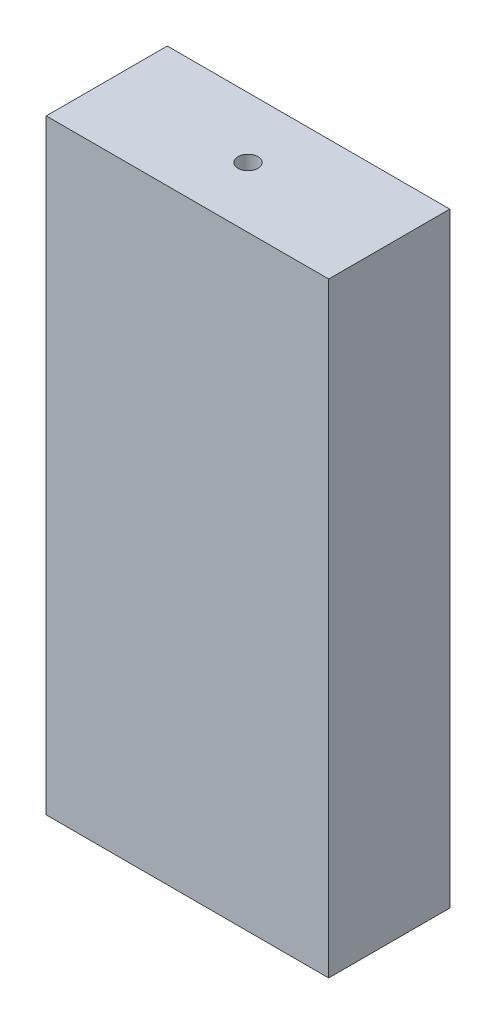
ISO-10303-21;
HEADER;
FILE_DESCRIPTION(('STEP AP214'),'2;1');
FILE_NAME('part.step','',(''),(''),'','','');
FILE_SCHEMA(('AUTOMOTIVE_DESIGN { 1 0 10303 214 1 1 1 1 }'));
ENDSEC;
DATA;
#1=APPLICATION_CONTEXT('core data for automotive mechanical design processes');
#2=APPLICATION_PROTOCOL_DEFINITION('international standard','automotive_design',2000,#1);
#3=PRODUCT_CONTEXT('',#1,'mechanical');
#4=PRODUCT('Part','Part','',(#3));
#5=PRODUCT_RELATED_PRODUCT_CATEGORY('part','',(#4));
#6=PRODUCT_DEFINITION_FORMATION('','',#4);
#7=PRODUCT_DEFINITION_CONTEXT('part definition',#1,'design');
#8=PRODUCT_DEFINITION('design','',#6,#7);
#9=PRODUCT_DEFINITION_SHAPE('','',#8);
#10=(LENGTH_UNIT() NAMED_UNIT(*) SI_UNIT(.MILLI.,.METRE.));
#11=(NAMED_UNIT(*) PLANE_ANGLE_UNIT() SI_UNIT($,.RADIAN.));
#12=(NAMED_UNIT(*) SI_UNIT($,.STERADIAN.) SOLID_ANGLE_UNIT());
#13=UNCERTAINTY_MEASURE_WITH_UNIT(LENGTH_MEASURE(1.E-05),#10,'distance_accuracy_value','');
#14=(GEOMETRIC_REPRESENTATION_CONTEXT(3) GLOBAL_UNCERTAINTY_ASSIGNED_CONTEXT((#13)) GLOBAL_UNIT_ASSIGNED_CONTEXT((#10,
#11,#12)) REPRESENTATION_CONTEXT('',''));
#15=CARTESIAN_POINT('',(0.,0.,0.));
#16=DIRECTION('',(0.,0.,1.));
#17=DIRECTION('',(1.,0.,0.));
#18=AXIS2_PLACEMENT_3D('',#15,#16,#17);
#19=CARTESIAN_POINT('',(0.,190.5,0.));
#20=DIRECTION('',(0.,-1.,0.));
#21=DIRECTION('',(0.,0.,-1.));
#22=AXIS2_PLACEMENT_3D('',#19,#20,#21);
#23=PLANE('',#22);
#24=DIRECTION('',(0.,0.,1.));
#25=VECTOR('',#24,1.);
#26=CARTESIAN_POINT('',(0.,190.5,0.));
#27=LINE('',#26,#25);
#28=CARTESIAN_POINT('',(0.,190.5,-38.1));
#29=VERTEX_POINT('',#28);
#30=CARTESIAN_POINT('',(0.,190.5,0.));
#31=VERTEX_POINT('',#30);
#32=EDGE_CURVE('E92',#29,#31,#27,.T.);
#33=ORIENTED_EDGE('',*,*,#32,.T.);
#34=DIRECTION('',(1.,0.,0.));
#35=VECTOR('',#34,1.);
#36=CARTESIAN_POINT('',(0.,190.5,0.));
#37=LINE('',#36,#35);
#38=CARTESIAN_POINT('',(88.9,190.5,0.));
#39=VERTEX_POINT('',#38);
#40=EDGE_CURVE('E87',#31,#39,#37,.T.);
#41=ORIENTED_EDGE('',*,*,#40,.T.);
#42=DIRECTION('',(0.,0.,-1.));
#43=VECTOR('',#42,1.);
#44=CARTESIAN_POINT('',(88.9,190.5,0.));
#45=LINE('',#44,#43);
#46=CARTESIAN_POINT('',(88.9,190.5,-38.1));
#47=VERTEX_POINT('',#46);
#48=EDGE_CURVE('E90',#39,#47,#45,.T.);
#49=ORIENTED_EDGE('',*,*,#48,.T.);
#50=DIRECTION('',(-1.,0.,0.));
#51=VECTOR('',#50,1.);
#52=CARTESIAN_POINT('',(0.,190.5,-38.1));
#53=LINE('',#52,#51);
#54=EDGE_CURVE('E57',#47,#29,#53,.T.);
#55=ORIENTED_EDGE('',*,*,#54,.T.);
#56=EDGE_LOOP('',(#33,#41,#49,#55));
#57=FACE_BOUND('',#56,.T.);
#58=CARTESIAN_POINT('',(44.45,190.5,-19.05));
#59=DIRECTION('',(0.,1.,0.));
#60=DIRECTION('',(0.,0.,1.));
#61=AXIS2_PLACEMENT_3D('',#58,#59,#60);
#62=CIRCLE('',#61,3.175);
#63=CARTESIAN_POINT('',(44.45,190.5,-15.875));
#64=VERTEX_POINT('',#63);
#65=EDGE_CURVE('E112',#64,#64,#62,.T.);
#66=ORIENTED_EDGE('',*,*,#65,.F.);
#67=EDGE_LOOP('',(#66));
#68=FACE_BOUND('',#67,.T.);
#69=ADVANCED_FACE('F39',(#57,#68),#23,.F.);
#70=CARTESIAN_POINT('',(0.,0.,0.));
#71=DIRECTION('',(0.,-1.,0.));
#72=DIRECTION('',(0.,0.,-1.));
#73=AXIS2_PLACEMENT_3D('',#70,#71,#72);
#74=PLANE('',#73);
#75=DIRECTION('',(0.,0.,1.));
#76=VECTOR('',#75,1.);
#77=CARTESIAN_POINT('',(0.,0.,0.));
#78=LINE('',#77,#76);
#79=CARTESIAN_POINT('',(0.,0.,-38.1));
#80=VERTEX_POINT('',#79);
#81=CARTESIAN_POINT('',(0.,0.,0.));
#82=VERTEX_POINT('',#81);
#83=EDGE_CURVE('E108',#80,#82,#78,.T.);
#84=ORIENTED_EDGE('',*,*,#83,.F.);
#85=DIRECTION('',(-1.,0.,0.));
#86=VECTOR('',#85,1.);
#87=CARTESIAN_POINT('',(0.,0.,-38.1));
#88=LINE('',#87,#86);
#89=CARTESIAN_POINT('',(88.9,0.,-38.1));
#90=VERTEX_POINT('',#89);
#91=EDGE_CURVE('E80',#90,#80,#88,.T.);
#92=ORIENTED_EDGE('',*,*,#91,.F.);
#93=DIRECTION('',(0.,0.,-1.));
#94=VECTOR('',#93,1.);
#95=CARTESIAN_POINT('',(88.9,0.,0.));
#96=LINE('',#95,#94);
#97=CARTESIAN_POINT('',(88.9,0.,0.));
#98=VERTEX_POINT('',#97);
#99=EDGE_CURVE('E74',#98,#90,#96,.T.);
#100=ORIENTED_EDGE('',*,*,#99,.F.);
#101=DIRECTION('',(1.,0.,0.));
#102=VECTOR('',#101,1.);
#103=CARTESIAN_POINT('',(0.,0.,0.));
#104=LINE('',#103,#102);
#105=EDGE_CURVE('E97',#82,#98,#104,.T.);
#106=ORIENTED_EDGE('',*,*,#105,.F.);
#107=EDGE_LOOP('',(#84,#92,#100,#106));
#108=FACE_BOUND('',#107,.T.);
#109=CARTESIAN_POINT('',(44.45,0.,-19.05));
#110=DIRECTION('',(0.,1.,0.));
#111=DIRECTION('',(0.,0.,1.));
#112=AXIS2_PLACEMENT_3D('',#109,#110,#111);
#113=CIRCLE('',#112,3.175);
#114=CARTESIAN_POINT('',(44.45,0.,-15.875));
#115=VERTEX_POINT('',#114);
#116=EDGE_CURVE('E130',#115,#115,#113,.T.);
#117=ORIENTED_EDGE('',*,*,#116,.T.);
#118=EDGE_LOOP('',(#117));
#119=FACE_BOUND('',#118,.T.);
#120=ADVANCED_FACE('F125',(#108,#119),#74,.T.);
#121=CARTESIAN_POINT('',(0.,190.5,0.));
#122=DIRECTION('',(1.,0.,0.));
#123=DIRECTION('',(0.,0.,-1.));
#124=AXIS2_PLACEMENT_3D('',#121,#122,#123);
#125=PLANE('',#124);
#126=ORIENTED_EDGE('',*,*,#83,.T.);
#127=DIRECTION('',(0.,-1.,0.));
#128=VECTOR('',#127,1.);
#129=CARTESIAN_POINT('',(0.,190.5,0.));
#130=LINE('',#129,#128);
#131=EDGE_CURVE('E11',#31,#82,#130,.T.);
#132=ORIENTED_EDGE('',*,*,#131,.F.);
#133=ORIENTED_EDGE('',*,*,#32,.F.);
#134=DIRECTION('',(0.,-1.,0.));
#135=VECTOR('',#134,1.);
#136=CARTESIAN_POINT('',(0.,190.5,-38.1));
#137=LINE('',#136,#135);
#138=EDGE_CURVE('E104',#29,#80,#137,.T.);
#139=ORIENTED_EDGE('',*,*,#138,.T.);
#140=EDGE_LOOP('',(#126,#132,#133,#139));
#141=FACE_BOUND('',#140,.T.);
#142=ADVANCED_FACE('F41',(#141),#125,.F.);
#143=CARTESIAN_POINT('',(0.,190.5,0.));
#144=DIRECTION('',(0.,0.,-1.));
#145=DIRECTION('',(-1.,0.,0.));
#146=AXIS2_PLACEMENT_3D('',#143,#144,#145);
#147=PLANE('',#146);
#148=ORIENTED_EDGE('',*,*,#105,.T.);
#149=DIRECTION('',(0.,-1.,0.));
#150=VECTOR('',#149,1.);
#151=CARTESIAN_POINT('',(88.9,190.5,0.));
#152=LINE('',#151,#150);
#153=EDGE_CURVE('E49',#39,#98,#152,.T.);
#154=ORIENTED_EDGE('',*,*,#153,.F.);
#155=ORIENTED_EDGE('',*,*,#40,.F.);
#156=ORIENTED_EDGE('',*,*,#131,.T.);
#157=EDGE_LOOP('',(#148,#154,#155,#156));
#158=FACE_BOUND('',#157,.T.);
#159=ADVANCED_FACE('F96',(#158),#147,.F.);
#160=CARTESIAN_POINT('',(88.9,190.5,0.));
#161=DIRECTION('',(-1.,0.,0.));
#162=DIRECTION('',(0.,0.,1.));
#163=AXIS2_PLACEMENT_3D('',#160,#161,#162);
#164=PLANE('',#163);
#165=ORIENTED_EDGE('',*,*,#99,.T.);
#166=DIRECTION('',(0.,-1.,0.));
#167=VECTOR('',#166,1.);
#168=CARTESIAN_POINT('',(88.9,190.5,-38.1));
#169=LINE('',#168,#167);
#170=EDGE_CURVE('E99',#47,#90,#169,.T.);
#171=ORIENTED_EDGE('',*,*,#170,.F.);
#172=ORIENTED_EDGE('',*,*,#48,.F.);
#173=ORIENTED_EDGE('',*,*,#153,.T.);
#174=EDGE_LOOP('',(#165,#171,#172,#173));
#175=FACE_BOUND('',#174,.T.);
#176=ADVANCED_FACE('F100',(#175),#164,.F.);
#177=CARTESIAN_POINT('',(0.,190.5,-38.1));
#178=DIRECTION('',(0.,0.,1.));
#179=DIRECTION('',(1.,0.,0.));
#180=AXIS2_PLACEMENT_3D('',#177,#178,#179);
#181=PLANE('',#180);
#182=ORIENTED_EDGE('',*,*,#91,.T.);
#183=ORIENTED_EDGE('',*,*,#138,.F.);
#184=ORIENTED_EDGE('',*,*,#54,.F.);
#185=ORIENTED_EDGE('',*,*,#170,.T.);
#186=EDGE_LOOP('',(#182,#183,#184,#185));
#187=FACE_BOUND('',#186,.T.);
#188=ADVANCED_FACE('F122',(#187),#181,.F.);
#189=CARTESIAN_POINT('',(44.45,190.5,-19.05));
#190=DIRECTION('',(0.,-1.,0.));
#191=DIRECTION('',(0.,0.,-1.));
#192=AXIS2_PLACEMENT_3D('',#189,#190,#191);
#193=CYLINDRICAL_SURFACE('',#192,3.175);
#194=ORIENTED_EDGE('',*,*,#65,.T.);
#195=EDGE_LOOP('',(#194));
#196=FACE_BOUND('',#195,.T.);
#197=ORIENTED_EDGE('',*,*,#116,.F.);
#198=EDGE_LOOP('',(#197));
#199=FACE_BOUND('',#198,.T.);
#200=ADVANCED_FACE('F138',(#196,#199),#193,.F.);
#201=CLOSED_SHELL('',(#69,#120,#142,#159,#176,#188,#200));
#202=MANIFOLD_SOLID_BREP('B2',#201);
#203=ADVANCED_BREP_SHAPE_REPRESENTATION('',(#18,#202),#14);
#204=SHAPE_DEFINITION_REPRESENTATION(#9,#203);
ENDSEC;
END-ISO-10303-21;
